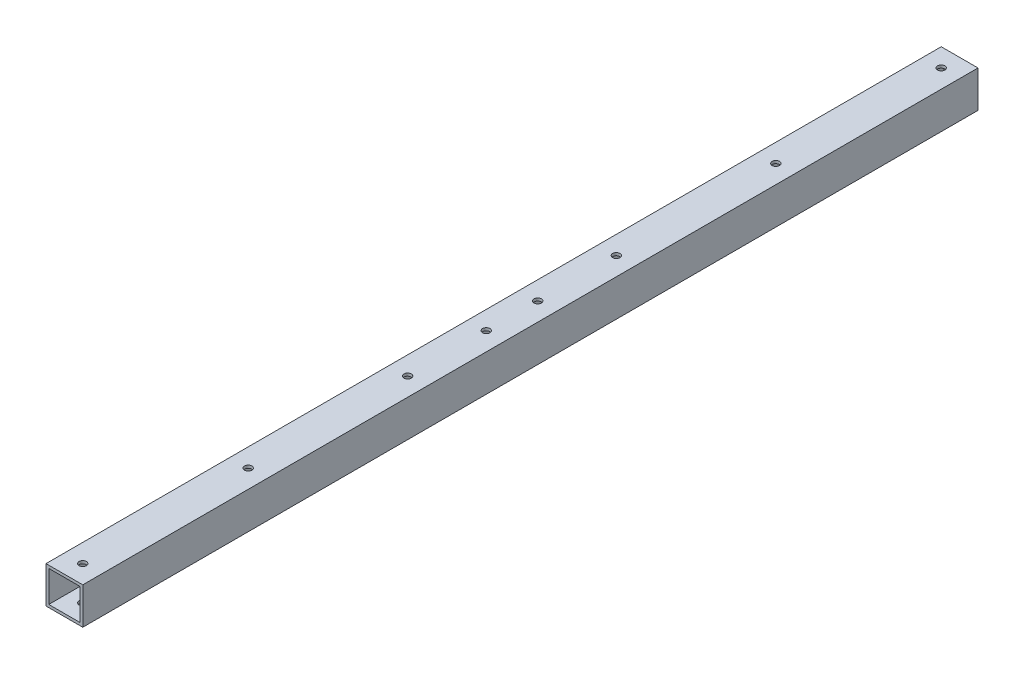
ISO-10303-21;
HEADER;
FILE_DESCRIPTION(('STEP AP214'),'2;1');
FILE_NAME('part.step','',(''),(''),'','','');
FILE_SCHEMA(('AUTOMOTIVE_DESIGN { 1 0 10303 214 1 1 1 1 }'));
ENDSEC;
DATA;
#1=APPLICATION_CONTEXT('core data for automotive mechanical design processes');
#2=APPLICATION_PROTOCOL_DEFINITION('international standard','automotive_design',2000,#1);
#3=PRODUCT_CONTEXT('',#1,'mechanical');
#4=PRODUCT('Part','Part','',(#3));
#5=PRODUCT_RELATED_PRODUCT_CATEGORY('part','',(#4));
#6=PRODUCT_DEFINITION_FORMATION('','',#4);
#7=PRODUCT_DEFINITION_CONTEXT('part definition',#1,'design');
#8=PRODUCT_DEFINITION('design','',#6,#7);
#9=PRODUCT_DEFINITION_SHAPE('','',#8);
#10=(LENGTH_UNIT() NAMED_UNIT(*) SI_UNIT(.MILLI.,.METRE.));
#11=(NAMED_UNIT(*) PLANE_ANGLE_UNIT() SI_UNIT($,.RADIAN.));
#12=(NAMED_UNIT(*) SI_UNIT($,.STERADIAN.) SOLID_ANGLE_UNIT());
#13=UNCERTAINTY_MEASURE_WITH_UNIT(LENGTH_MEASURE(1.E-05),#10,'distance_accuracy_value','');
#14=(GEOMETRIC_REPRESENTATION_CONTEXT(3) GLOBAL_UNCERTAINTY_ASSIGNED_CONTEXT((#13)) GLOBAL_UNIT_ASSIGNED_CONTEXT((#10,
#11,#12)) REPRESENTATION_CONTEXT('',''));
#15=CARTESIAN_POINT('',(0.,0.,0.));
#16=DIRECTION('',(0.,0.,1.));
#17=DIRECTION('',(1.,0.,0.));
#18=AXIS2_PLACEMENT_3D('',#15,#16,#17);
#19=CARTESIAN_POINT('',(0.,0.,487.));
#20=DIRECTION('',(0.,0.,1.));
#21=DIRECTION('',(1.,0.,0.));
#22=AXIS2_PLACEMENT_3D('',#19,#20,#21);
#23=PLANE('',#22);
#24=DIRECTION('',(0.,1.,0.));
#25=VECTOR('',#24,1.);
#26=CARTESIAN_POINT('',(10.,10.,487.));
#27=LINE('',#26,#25);
#28=CARTESIAN_POINT('',(10.,-10.,487.));
#29=VERTEX_POINT('',#28);
#30=CARTESIAN_POINT('',(10.,10.,487.));
#31=VERTEX_POINT('',#30);
#32=EDGE_CURVE('E156',#29,#31,#27,.T.);
#33=ORIENTED_EDGE('',*,*,#32,.T.);
#34=DIRECTION('',(-1.,0.,0.));
#35=VECTOR('',#34,1.);
#36=CARTESIAN_POINT('',(-10.,10.,487.));
#37=LINE('',#36,#35);
#38=CARTESIAN_POINT('',(-10.,10.,487.));
#39=VERTEX_POINT('',#38);
#40=EDGE_CURVE('E160',#31,#39,#37,.T.);
#41=ORIENTED_EDGE('',*,*,#40,.T.);
#42=DIRECTION('',(0.,-1.,0.));
#43=VECTOR('',#42,1.);
#44=CARTESIAN_POINT('',(-10.,10.,487.));
#45=LINE('',#44,#43);
#46=CARTESIAN_POINT('',(-10.,-10.,487.));
#47=VERTEX_POINT('',#46);
#48=EDGE_CURVE('E164',#39,#47,#45,.T.);
#49=ORIENTED_EDGE('',*,*,#48,.T.);
#50=DIRECTION('',(1.,0.,0.));
#51=VECTOR('',#50,1.);
#52=CARTESIAN_POINT('',(-10.,-10.,487.));
#53=LINE('',#52,#51);
#54=EDGE_CURVE('E167',#47,#29,#53,.T.);
#55=ORIENTED_EDGE('',*,*,#54,.T.);
#56=EDGE_LOOP('',(#33,#41,#49,#55));
#57=FACE_BOUND('',#56,.T.);
#58=DIRECTION('',(-1.,0.,0.));
#59=VECTOR('',#58,1.);
#60=CARTESIAN_POINT('',(-8.5,8.5,487.));
#61=LINE('',#60,#59);
#62=CARTESIAN_POINT('',(8.5,8.5,487.));
#63=VERTEX_POINT('',#62);
#64=CARTESIAN_POINT('',(-8.5,8.5,487.));
#65=VERTEX_POINT('',#64);
#66=EDGE_CURVE('E115',#63,#65,#61,.T.);
#67=ORIENTED_EDGE('',*,*,#66,.F.);
#68=DIRECTION('',(0.,1.,0.));
#69=VECTOR('',#68,1.);
#70=CARTESIAN_POINT('',(8.5,8.5,487.));
#71=LINE('',#70,#69);
#72=CARTESIAN_POINT('',(8.50000000000001,-8.5,487.));
#73=VERTEX_POINT('',#72);
#74=EDGE_CURVE('E106',#73,#63,#71,.T.);
#75=ORIENTED_EDGE('',*,*,#74,.F.);
#76=DIRECTION('',(1.,0.,0.));
#77=VECTOR('',#76,1.);
#78=CARTESIAN_POINT('',(-8.5,-8.5,487.));
#79=LINE('',#78,#77);
#80=CARTESIAN_POINT('',(-8.5,-8.5,487.));
#81=VERTEX_POINT('',#80);
#82=EDGE_CURVE('E132',#81,#73,#79,.T.);
#83=ORIENTED_EDGE('',*,*,#82,.F.);
#84=DIRECTION('',(0.,-1.,0.));
#85=VECTOR('',#84,1.);
#86=CARTESIAN_POINT('',(-8.5,8.5,487.));
#87=LINE('',#86,#85);
#88=EDGE_CURVE('E128',#65,#81,#87,.T.);
#89=ORIENTED_EDGE('',*,*,#88,.F.);
#90=EDGE_LOOP('',(#67,#75,#83,#89));
#91=FACE_BOUND('',#90,.T.);
#92=ADVANCED_FACE('F38',(#57,#91),#23,.T.);
#93=CARTESIAN_POINT('',(0.,0.,0.));
#94=DIRECTION('',(0.,0.,1.));
#95=DIRECTION('',(1.,0.,0.));
#96=AXIS2_PLACEMENT_3D('',#93,#94,#95);
#97=PLANE('',#96);
#98=DIRECTION('',(0.,1.,0.));
#99=VECTOR('',#98,1.);
#100=CARTESIAN_POINT('',(10.,10.,0.));
#101=LINE('',#100,#99);
#102=CARTESIAN_POINT('',(10.,-10.,0.));
#103=VERTEX_POINT('',#102);
#104=CARTESIAN_POINT('',(10.,10.,0.));
#105=VERTEX_POINT('',#104);
#106=EDGE_CURVE('E124',#103,#105,#101,.T.);
#107=ORIENTED_EDGE('',*,*,#106,.F.);
#108=DIRECTION('',(1.,0.,0.));
#109=VECTOR('',#108,1.);
#110=CARTESIAN_POINT('',(-10.,-10.,0.));
#111=LINE('',#110,#109);
#112=CARTESIAN_POINT('',(-10.,-10.,0.));
#113=VERTEX_POINT('',#112);
#114=EDGE_CURVE('E161',#113,#103,#111,.T.);
#115=ORIENTED_EDGE('',*,*,#114,.F.);
#116=DIRECTION('',(0.,-1.,0.));
#117=VECTOR('',#116,1.);
#118=CARTESIAN_POINT('',(-10.,10.,0.));
#119=LINE('',#118,#117);
#120=CARTESIAN_POINT('',(-10.,10.,0.));
#121=VERTEX_POINT('',#120);
#122=EDGE_CURVE('E177',#121,#113,#119,.T.);
#123=ORIENTED_EDGE('',*,*,#122,.F.);
#124=DIRECTION('',(-1.,0.,0.));
#125=VECTOR('',#124,1.);
#126=CARTESIAN_POINT('',(-10.,10.,0.));
#127=LINE('',#126,#125);
#128=EDGE_CURVE('E174',#105,#121,#127,.T.);
#129=ORIENTED_EDGE('',*,*,#128,.F.);
#130=EDGE_LOOP('',(#107,#115,#123,#129));
#131=FACE_BOUND('',#130,.T.);
#132=DIRECTION('',(0.,1.,0.));
#133=VECTOR('',#132,1.);
#134=CARTESIAN_POINT('',(8.5,8.5,0.));
#135=LINE('',#134,#133);
#136=CARTESIAN_POINT('',(8.50000000000001,-8.5,0.));
#137=VERTEX_POINT('',#136);
#138=CARTESIAN_POINT('',(8.5,8.5,0.));
#139=VERTEX_POINT('',#138);
#140=EDGE_CURVE('E64',#137,#139,#135,.T.);
#141=ORIENTED_EDGE('',*,*,#140,.T.);
#142=DIRECTION('',(-1.,0.,0.));
#143=VECTOR('',#142,1.);
#144=CARTESIAN_POINT('',(-8.5,8.5,0.));
#145=LINE('',#144,#143);
#146=CARTESIAN_POINT('',(-8.5,8.5,0.));
#147=VERTEX_POINT('',#146);
#148=EDGE_CURVE('E122',#139,#147,#145,.T.);
#149=ORIENTED_EDGE('',*,*,#148,.T.);
#150=DIRECTION('',(0.,-1.,0.));
#151=VECTOR('',#150,1.);
#152=CARTESIAN_POINT('',(-8.5,8.5,0.));
#153=LINE('',#152,#151);
#154=CARTESIAN_POINT('',(-8.5,-8.5,0.));
#155=VERTEX_POINT('',#154);
#156=EDGE_CURVE('E143',#147,#155,#153,.T.);
#157=ORIENTED_EDGE('',*,*,#156,.T.);
#158=DIRECTION('',(1.,0.,0.));
#159=VECTOR('',#158,1.);
#160=CARTESIAN_POINT('',(-8.5,-8.5,0.));
#161=LINE('',#160,#159);
#162=EDGE_CURVE('E116',#155,#137,#161,.T.);
#163=ORIENTED_EDGE('',*,*,#162,.T.);
#164=EDGE_LOOP('',(#141,#149,#157,#163));
#165=FACE_BOUND('',#164,.T.);
#166=ADVANCED_FACE('F359',(#131,#165),#97,.F.);
#167=CARTESIAN_POINT('',(10.,10.,487.));
#168=DIRECTION('',(-1.,0.,0.));
#169=DIRECTION('',(0.,0.,1.));
#170=AXIS2_PLACEMENT_3D('',#167,#168,#169);
#171=PLANE('',#170);
#172=ORIENTED_EDGE('',*,*,#106,.T.);
#173=DIRECTION('',(0.,0.,-1.));
#174=VECTOR('',#173,1.);
#175=CARTESIAN_POINT('',(10.,10.,487.));
#176=LINE('',#175,#174);
#177=EDGE_CURVE('E11',#31,#105,#176,.T.);
#178=ORIENTED_EDGE('',*,*,#177,.F.);
#179=ORIENTED_EDGE('',*,*,#32,.F.);
#180=DIRECTION('',(0.,0.,-1.));
#181=VECTOR('',#180,1.);
#182=CARTESIAN_POINT('',(10.,-10.,487.));
#183=LINE('',#182,#181);
#184=EDGE_CURVE('E170',#29,#103,#183,.T.);
#185=ORIENTED_EDGE('',*,*,#184,.T.);
#186=EDGE_LOOP('',(#172,#178,#179,#185));
#187=FACE_BOUND('',#186,.T.);
#188=ADVANCED_FACE('F40',(#187),#171,.F.);
#189=CARTESIAN_POINT('',(-10.,10.,487.));
#190=DIRECTION('',(0.,-1.,0.));
#191=DIRECTION('',(0.,0.,-1.));
#192=AXIS2_PLACEMENT_3D('',#189,#190,#191);
#193=PLANE('',#192);
#194=CARTESIAN_POINT('',(0.,10.,229.5));
#195=DIRECTION('',(0.,1.,0.));
#196=DIRECTION('',(0.,0.,1.));
#197=AXIS2_PLACEMENT_3D('',#194,#195,#196);
#198=CIRCLE('',#197,2.);
#199=CARTESIAN_POINT('',(0.,10.,231.5));
#200=VERTEX_POINT('',#199);
#201=EDGE_CURVE('E233',#200,#200,#198,.T.);
#202=ORIENTED_EDGE('',*,*,#201,.F.);
#203=EDGE_LOOP('',(#202));
#204=FACE_BOUND('',#203,.T.);
#205=CARTESIAN_POINT('',(0.,10.,257.5));
#206=DIRECTION('',(0.,1.,0.));
#207=DIRECTION('',(0.,0.,1.));
#208=AXIS2_PLACEMENT_3D('',#205,#206,#207);
#209=CIRCLE('',#208,2.);
#210=CARTESIAN_POINT('',(0.,10.,259.5));
#211=VERTEX_POINT('',#210);
#212=EDGE_CURVE('E245',#211,#211,#209,.T.);
#213=ORIENTED_EDGE('',*,*,#212,.F.);
#214=EDGE_LOOP('',(#213));
#215=FACE_BOUND('',#214,.T.);
#216=CARTESIAN_POINT('',(0.,10.,10.));
#217=DIRECTION('',(0.,1.,0.));
#218=DIRECTION('',(0.,0.,1.));
#219=AXIS2_PLACEMENT_3D('',#216,#217,#218);
#220=CIRCLE('',#219,2.);
#221=CARTESIAN_POINT('',(0.,10.,12.));
#222=VERTEX_POINT('',#221);
#223=EDGE_CURVE('E257',#222,#222,#220,.T.);
#224=ORIENTED_EDGE('',*,*,#223,.F.);
#225=EDGE_LOOP('',(#224));
#226=FACE_BOUND('',#225,.T.);
#227=CARTESIAN_POINT('',(0.,10.,300.25));
#228=DIRECTION('',(0.,1.,0.));
#229=DIRECTION('',(0.,0.,1.));
#230=AXIS2_PLACEMENT_3D('',#227,#228,#229);
#231=CIRCLE('',#230,2.00000000000001);
#232=CARTESIAN_POINT('',(0.,10.,302.25));
#233=VERTEX_POINT('',#232);
#234=EDGE_CURVE('E253',#233,#233,#231,.T.);
#235=ORIENTED_EDGE('',*,*,#234,.F.);
#236=EDGE_LOOP('',(#235));
#237=FACE_BOUND('',#236,.T.);
#238=CARTESIAN_POINT('',(0.,10.,477.));
#239=DIRECTION('',(0.,1.,0.));
#240=DIRECTION('',(0.,0.,1.));
#241=AXIS2_PLACEMENT_3D('',#238,#239,#240);
#242=CIRCLE('',#241,2.);
#243=CARTESIAN_POINT('',(0.,10.,479.));
#244=VERTEX_POINT('',#243);
#245=EDGE_CURVE('E289',#244,#244,#242,.T.);
#246=ORIENTED_EDGE('',*,*,#245,.F.);
#247=EDGE_LOOP('',(#246));
#248=FACE_BOUND('',#247,.T.);
#249=CARTESIAN_POINT('',(0.,10.,100.));
#250=DIRECTION('',(0.,1.,0.));
#251=DIRECTION('',(0.,0.,1.));
#252=AXIS2_PLACEMENT_3D('',#249,#250,#251);
#253=CIRCLE('',#252,2.);
#254=CARTESIAN_POINT('',(0.,10.,102.));
#255=VERTEX_POINT('',#254);
#256=EDGE_CURVE('E274',#255,#255,#253,.T.);
#257=ORIENTED_EDGE('',*,*,#256,.F.);
#258=EDGE_LOOP('',(#257));
#259=FACE_BOUND('',#258,.T.);
#260=CARTESIAN_POINT('',(0.,10.,387.));
#261=DIRECTION('',(0.,1.,0.));
#262=DIRECTION('',(0.,0.,1.));
#263=AXIS2_PLACEMENT_3D('',#260,#261,#262);
#264=CIRCLE('',#263,2.);
#265=CARTESIAN_POINT('',(0.,10.,389.));
#266=VERTEX_POINT('',#265);
#267=EDGE_CURVE('E275',#266,#266,#264,.T.);
#268=ORIENTED_EDGE('',*,*,#267,.F.);
#269=EDGE_LOOP('',(#268));
#270=FACE_BOUND('',#269,.T.);
#271=CARTESIAN_POINT('',(0.,10.,186.75));
#272=DIRECTION('',(0.,1.,0.));
#273=DIRECTION('',(0.,0.,1.));
#274=AXIS2_PLACEMENT_3D('',#271,#272,#273);
#275=CIRCLE('',#274,2.00000000000001);
#276=CARTESIAN_POINT('',(0.,10.,188.75));
#277=VERTEX_POINT('',#276);
#278=EDGE_CURVE('E266',#277,#277,#275,.T.);
#279=ORIENTED_EDGE('',*,*,#278,.F.);
#280=EDGE_LOOP('',(#279));
#281=FACE_BOUND('',#280,.T.);
#282=ORIENTED_EDGE('',*,*,#128,.T.);
#283=DIRECTION('',(0.,0.,-1.));
#284=VECTOR('',#283,1.);
#285=CARTESIAN_POINT('',(-10.,10.,487.));
#286=LINE('',#285,#284);
#287=EDGE_CURVE('E48',#39,#121,#286,.T.);
#288=ORIENTED_EDGE('',*,*,#287,.F.);
#289=ORIENTED_EDGE('',*,*,#40,.F.);
#290=ORIENTED_EDGE('',*,*,#177,.T.);
#291=EDGE_LOOP('',(#282,#288,#289,#290));
#292=FACE_BOUND('',#291,.T.);
#293=ADVANCED_FACE('F345',(#204,#215,#226,#237,#248,#259,#270,#281,#292),#193,.F.);
#294=CARTESIAN_POINT('',(-10.,10.,487.));
#295=DIRECTION('',(1.,0.,0.));
#296=DIRECTION('',(0.,1.,0.));
#297=AXIS2_PLACEMENT_3D('',#294,#295,#296);
#298=PLANE('',#297);
#299=ORIENTED_EDGE('',*,*,#122,.T.);
#300=DIRECTION('',(0.,0.,-1.));
#301=VECTOR('',#300,1.);
#302=CARTESIAN_POINT('',(-10.,-10.,487.));
#303=LINE('',#302,#301);
#304=EDGE_CURVE('E185',#47,#113,#303,.T.);
#305=ORIENTED_EDGE('',*,*,#304,.F.);
#306=ORIENTED_EDGE('',*,*,#48,.F.);
#307=ORIENTED_EDGE('',*,*,#287,.T.);
#308=EDGE_LOOP('',(#299,#305,#306,#307));
#309=FACE_BOUND('',#308,.T.);
#310=ADVANCED_FACE('F348',(#309),#298,.F.);
#311=CARTESIAN_POINT('',(-10.,-10.,487.));
#312=DIRECTION('',(0.,1.,0.));
#313=DIRECTION('',(0.,0.,1.));
#314=AXIS2_PLACEMENT_3D('',#311,#312,#313);
#315=PLANE('',#314);
#316=CARTESIAN_POINT('',(0.,-10.,229.5));
#317=DIRECTION('',(0.,1.,0.));
#318=DIRECTION('',(0.,0.,1.));
#319=AXIS2_PLACEMENT_3D('',#316,#317,#318);
#320=CIRCLE('',#319,2.);
#321=CARTESIAN_POINT('',(0.,-10.,231.5));
#322=VERTEX_POINT('',#321);
#323=EDGE_CURVE('E225',#322,#322,#320,.T.);
#324=ORIENTED_EDGE('',*,*,#323,.T.);
#325=EDGE_LOOP('',(#324));
#326=FACE_BOUND('',#325,.T.);
#327=CARTESIAN_POINT('',(0.,-10.,257.5));
#328=DIRECTION('',(0.,1.,0.));
#329=DIRECTION('',(0.,0.,1.));
#330=AXIS2_PLACEMENT_3D('',#327,#328,#329);
#331=CIRCLE('',#330,2.);
#332=CARTESIAN_POINT('',(0.,-10.,259.5));
#333=VERTEX_POINT('',#332);
#334=EDGE_CURVE('E239',#333,#333,#331,.T.);
#335=ORIENTED_EDGE('',*,*,#334,.T.);
#336=EDGE_LOOP('',(#335));
#337=FACE_BOUND('',#336,.T.);
#338=CARTESIAN_POINT('',(0.,-10.,10.));
#339=DIRECTION('',(0.,1.,0.));
#340=DIRECTION('',(0.,0.,1.));
#341=AXIS2_PLACEMENT_3D('',#338,#339,#340);
#342=CIRCLE('',#341,2.);
#343=CARTESIAN_POINT('',(0.,-10.,12.));
#344=VERTEX_POINT('',#343);
#345=EDGE_CURVE('E197',#344,#344,#342,.T.);
#346=ORIENTED_EDGE('',*,*,#345,.T.);
#347=EDGE_LOOP('',(#346));
#348=FACE_BOUND('',#347,.T.);
#349=CARTESIAN_POINT('',(0.,-10.,300.25));
#350=DIRECTION('',(0.,1.,0.));
#351=DIRECTION('',(0.,0.,1.));
#352=AXIS2_PLACEMENT_3D('',#349,#350,#351);
#353=CIRCLE('',#352,2.00000000000001);
#354=CARTESIAN_POINT('',(0.,-10.,302.25));
#355=VERTEX_POINT('',#354);
#356=EDGE_CURVE('E262',#355,#355,#353,.T.);
#357=ORIENTED_EDGE('',*,*,#356,.T.);
#358=EDGE_LOOP('',(#357));
#359=FACE_BOUND('',#358,.T.);
#360=CARTESIAN_POINT('',(0.,-10.,477.));
#361=DIRECTION('',(0.,1.,0.));
#362=DIRECTION('',(0.,0.,1.));
#363=AXIS2_PLACEMENT_3D('',#360,#361,#362);
#364=CIRCLE('',#363,2.);
#365=CARTESIAN_POINT('',(0.,-10.,479.));
#366=VERTEX_POINT('',#365);
#367=EDGE_CURVE('E261',#366,#366,#364,.T.);
#368=ORIENTED_EDGE('',*,*,#367,.T.);
#369=EDGE_LOOP('',(#368));
#370=FACE_BOUND('',#369,.T.);
#371=CARTESIAN_POINT('',(0.,-10.,100.));
#372=DIRECTION('',(0.,1.,0.));
#373=DIRECTION('',(0.,0.,1.));
#374=AXIS2_PLACEMENT_3D('',#371,#372,#373);
#375=CIRCLE('',#374,2.);
#376=CARTESIAN_POINT('',(0.,-10.,102.));
#377=VERTEX_POINT('',#376);
#378=EDGE_CURVE('E293',#377,#377,#375,.T.);
#379=ORIENTED_EDGE('',*,*,#378,.T.);
#380=EDGE_LOOP('',(#379));
#381=FACE_BOUND('',#380,.T.);
#382=CARTESIAN_POINT('',(0.,-10.,387.));
#383=DIRECTION('',(0.,1.,0.));
#384=DIRECTION('',(0.,0.,1.));
#385=AXIS2_PLACEMENT_3D('',#382,#383,#384);
#386=CIRCLE('',#385,2.);
#387=CARTESIAN_POINT('',(0.,-10.,389.));
#388=VERTEX_POINT('',#387);
#389=EDGE_CURVE('E270',#388,#388,#386,.T.);
#390=ORIENTED_EDGE('',*,*,#389,.T.);
#391=EDGE_LOOP('',(#390));
#392=FACE_BOUND('',#391,.T.);
#393=CARTESIAN_POINT('',(0.,-10.,186.75));
#394=DIRECTION('',(0.,1.,0.));
#395=DIRECTION('',(0.,0.,1.));
#396=AXIS2_PLACEMENT_3D('',#393,#394,#395);
#397=CIRCLE('',#396,2.00000000000001);
#398=CARTESIAN_POINT('',(0.,-10.,188.75));
#399=VERTEX_POINT('',#398);
#400=EDGE_CURVE('E279',#399,#399,#397,.T.);
#401=ORIENTED_EDGE('',*,*,#400,.T.);
#402=EDGE_LOOP('',(#401));
#403=FACE_BOUND('',#402,.T.);
#404=ORIENTED_EDGE('',*,*,#114,.T.);
#405=ORIENTED_EDGE('',*,*,#184,.F.);
#406=ORIENTED_EDGE('',*,*,#54,.F.);
#407=ORIENTED_EDGE('',*,*,#304,.T.);
#408=EDGE_LOOP('',(#404,#405,#406,#407));
#409=FACE_BOUND('',#408,.T.);
#410=ADVANCED_FACE('F363',(#326,#337,#348,#359,#370,#381,#392,#403,#409),#315,.F.);
#411=CARTESIAN_POINT('',(8.5,8.5,487.));
#412=DIRECTION('',(-1.,0.,0.));
#413=DIRECTION('',(0.,-1.,0.));
#414=AXIS2_PLACEMENT_3D('',#411,#412,#413);
#415=PLANE('',#414);
#416=ORIENTED_EDGE('',*,*,#140,.F.);
#417=DIRECTION('',(0.,0.,-1.));
#418=VECTOR('',#417,1.);
#419=CARTESIAN_POINT('',(8.50000000000001,-8.5,487.));
#420=LINE('',#419,#418);
#421=EDGE_CURVE('E110',#73,#137,#420,.T.);
#422=ORIENTED_EDGE('',*,*,#421,.F.);
#423=ORIENTED_EDGE('',*,*,#74,.T.);
#424=DIRECTION('',(0.,0.,-1.));
#425=VECTOR('',#424,1.);
#426=CARTESIAN_POINT('',(8.5,8.5,487.));
#427=LINE('',#426,#425);
#428=EDGE_CURVE('E109',#63,#139,#427,.T.);
#429=ORIENTED_EDGE('',*,*,#428,.T.);
#430=EDGE_LOOP('',(#416,#422,#423,#429));
#431=FACE_BOUND('',#430,.T.);
#432=ADVANCED_FACE('F108',(#431),#415,.T.);
#433=CARTESIAN_POINT('',(-8.5,8.5,487.));
#434=DIRECTION('',(0.,-1.,0.));
#435=DIRECTION('',(0.,0.,-1.));
#436=AXIS2_PLACEMENT_3D('',#433,#434,#435);
#437=PLANE('',#436);
#438=CARTESIAN_POINT('',(0.,8.5,229.5));
#439=DIRECTION('',(0.,-1.,0.));
#440=DIRECTION('',(0.,0.,-1.));
#441=AXIS2_PLACEMENT_3D('',#438,#439,#440);
#442=CIRCLE('',#441,2.);
#443=CARTESIAN_POINT('',(0.,8.5,227.5));
#444=VERTEX_POINT('',#443);
#445=EDGE_CURVE('E249',#444,#444,#442,.T.);
#446=ORIENTED_EDGE('',*,*,#445,.F.);
#447=EDGE_LOOP('',(#446));
#448=FACE_BOUND('',#447,.T.);
#449=CARTESIAN_POINT('',(0.,8.5,257.5));
#450=DIRECTION('',(0.,-1.,0.));
#451=DIRECTION('',(0.,0.,-1.));
#452=AXIS2_PLACEMENT_3D('',#449,#450,#451);
#453=CIRCLE('',#452,2.);
#454=CARTESIAN_POINT('',(0.,8.5,255.5));
#455=VERTEX_POINT('',#454);
#456=EDGE_CURVE('E224',#455,#455,#453,.T.);
#457=ORIENTED_EDGE('',*,*,#456,.F.);
#458=EDGE_LOOP('',(#457));
#459=FACE_BOUND('',#458,.T.);
#460=CARTESIAN_POINT('',(0.,8.5,10.));
#461=DIRECTION('',(0.,-1.,0.));
#462=DIRECTION('',(0.,0.,-1.));
#463=AXIS2_PLACEMENT_3D('',#460,#461,#462);
#464=CIRCLE('',#463,2.);
#465=CARTESIAN_POINT('',(0.,8.5,8.));
#466=VERTEX_POINT('',#465);
#467=EDGE_CURVE('E140',#466,#466,#464,.T.);
#468=ORIENTED_EDGE('',*,*,#467,.F.);
#469=EDGE_LOOP('',(#468));
#470=FACE_BOUND('',#469,.T.);
#471=CARTESIAN_POINT('',(0.,8.5,300.25));
#472=DIRECTION('',(0.,-1.,0.));
#473=DIRECTION('',(0.,0.,-1.));
#474=AXIS2_PLACEMENT_3D('',#471,#472,#473);
#475=CIRCLE('',#474,2.00000000000001);
#476=CARTESIAN_POINT('',(0.,8.5,298.25));
#477=VERTEX_POINT('',#476);
#478=EDGE_CURVE('E217',#477,#477,#475,.T.);
#479=ORIENTED_EDGE('',*,*,#478,.F.);
#480=EDGE_LOOP('',(#479));
#481=FACE_BOUND('',#480,.T.);
#482=CARTESIAN_POINT('',(0.,8.5,477.));
#483=DIRECTION('',(0.,-1.,0.));
#484=DIRECTION('',(0.,0.,-1.));
#485=AXIS2_PLACEMENT_3D('',#482,#483,#484);
#486=CIRCLE('',#485,2.);
#487=CARTESIAN_POINT('',(0.,8.5,475.));
#488=VERTEX_POINT('',#487);
#489=EDGE_CURVE('E212',#488,#488,#486,.T.);
#490=ORIENTED_EDGE('',*,*,#489,.F.);
#491=EDGE_LOOP('',(#490));
#492=FACE_BOUND('',#491,.T.);
#493=CARTESIAN_POINT('',(0.,8.5,100.));
#494=DIRECTION('',(0.,-1.,0.));
#495=DIRECTION('',(0.,0.,-1.));
#496=AXIS2_PLACEMENT_3D('',#493,#494,#495);
#497=CIRCLE('',#496,2.);
#498=CARTESIAN_POINT('',(0.,8.5,98.));
#499=VERTEX_POINT('',#498);
#500=EDGE_CURVE('E207',#499,#499,#497,.T.);
#501=ORIENTED_EDGE('',*,*,#500,.F.);
#502=EDGE_LOOP('',(#501));
#503=FACE_BOUND('',#502,.T.);
#504=CARTESIAN_POINT('',(0.,8.5,387.));
#505=DIRECTION('',(0.,-1.,0.));
#506=DIRECTION('',(0.,0.,-1.));
#507=AXIS2_PLACEMENT_3D('',#504,#505,#506);
#508=CIRCLE('',#507,2.);
#509=CARTESIAN_POINT('',(0.,8.5,385.));
#510=VERTEX_POINT('',#509);
#511=EDGE_CURVE('E202',#510,#510,#508,.T.);
#512=ORIENTED_EDGE('',*,*,#511,.F.);
#513=EDGE_LOOP('',(#512));
#514=FACE_BOUND('',#513,.T.);
#515=CARTESIAN_POINT('',(0.,8.5,186.75));
#516=DIRECTION('',(0.,-1.,0.));
#517=DIRECTION('',(0.,0.,-1.));
#518=AXIS2_PLACEMENT_3D('',#515,#516,#517);
#519=CIRCLE('',#518,2.00000000000001);
#520=CARTESIAN_POINT('',(0.,8.5,184.75));
#521=VERTEX_POINT('',#520);
#522=EDGE_CURVE('E196',#521,#521,#519,.T.);
#523=ORIENTED_EDGE('',*,*,#522,.F.);
#524=EDGE_LOOP('',(#523));
#525=FACE_BOUND('',#524,.T.);
#526=ORIENTED_EDGE('',*,*,#148,.F.);
#527=ORIENTED_EDGE('',*,*,#428,.F.);
#528=ORIENTED_EDGE('',*,*,#66,.T.);
#529=DIRECTION('',(0.,0.,-1.));
#530=VECTOR('',#529,1.);
#531=CARTESIAN_POINT('',(-8.5,8.5,487.));
#532=LINE('',#531,#530);
#533=EDGE_CURVE('E125',#65,#147,#532,.T.);
#534=ORIENTED_EDGE('',*,*,#533,.T.);
#535=EDGE_LOOP('',(#526,#527,#528,#534));
#536=FACE_BOUND('',#535,.T.);
#537=ADVANCED_FACE('F119',(#448,#459,#470,#481,#492,#503,#514,#525,#536),#437,.T.);
#538=CARTESIAN_POINT('',(-8.5,8.5,487.));
#539=DIRECTION('',(1.,0.,0.));
#540=DIRECTION('',(0.,1.,0.));
#541=AXIS2_PLACEMENT_3D('',#538,#539,#540);
#542=PLANE('',#541);
#543=ORIENTED_EDGE('',*,*,#156,.F.);
#544=ORIENTED_EDGE('',*,*,#533,.F.);
#545=ORIENTED_EDGE('',*,*,#88,.T.);
#546=DIRECTION('',(0.,0.,-1.));
#547=VECTOR('',#546,1.);
#548=CARTESIAN_POINT('',(-8.5,-8.5,487.));
#549=LINE('',#548,#547);
#550=EDGE_CURVE('E56',#81,#155,#549,.T.);
#551=ORIENTED_EDGE('',*,*,#550,.T.);
#552=EDGE_LOOP('',(#543,#544,#545,#551));
#553=FACE_BOUND('',#552,.T.);
#554=ADVANCED_FACE('F323',(#553),#542,.T.);
#555=CARTESIAN_POINT('',(-8.5,-8.5,487.));
#556=DIRECTION('',(0.,1.,0.));
#557=DIRECTION('',(0.,0.,1.));
#558=AXIS2_PLACEMENT_3D('',#555,#556,#557);
#559=PLANE('',#558);
#560=CARTESIAN_POINT('',(0.,-8.5,229.5));
#561=DIRECTION('',(0.,1.,0.));
#562=DIRECTION('',(0.,0.,1.));
#563=AXIS2_PLACEMENT_3D('',#560,#561,#562);
#564=CIRCLE('',#563,2.);
#565=CARTESIAN_POINT('',(0.,-8.5,231.5));
#566=VERTEX_POINT('',#565);
#567=EDGE_CURVE('E42',#566,#566,#564,.T.);
#568=ORIENTED_EDGE('',*,*,#567,.F.);
#569=EDGE_LOOP('',(#568));
#570=FACE_BOUND('',#569,.T.);
#571=CARTESIAN_POINT('',(0.,-8.5,257.5));
#572=DIRECTION('',(0.,1.,0.));
#573=DIRECTION('',(0.,0.,1.));
#574=AXIS2_PLACEMENT_3D('',#571,#572,#573);
#575=CIRCLE('',#574,2.);
#576=CARTESIAN_POINT('',(0.,-8.5,259.5));
#577=VERTEX_POINT('',#576);
#578=EDGE_CURVE('E221',#577,#577,#575,.T.);
#579=ORIENTED_EDGE('',*,*,#578,.F.);
#580=EDGE_LOOP('',(#579));
#581=FACE_BOUND('',#580,.T.);
#582=CARTESIAN_POINT('',(0.,-8.5,10.));
#583=DIRECTION('',(0.,1.,0.));
#584=DIRECTION('',(0.,0.,1.));
#585=AXIS2_PLACEMENT_3D('',#582,#583,#584);
#586=CIRCLE('',#585,2.);
#587=CARTESIAN_POINT('',(0.,-8.5,12.));
#588=VERTEX_POINT('',#587);
#589=EDGE_CURVE('E218',#588,#588,#586,.T.);
#590=ORIENTED_EDGE('',*,*,#589,.F.);
#591=EDGE_LOOP('',(#590));
#592=FACE_BOUND('',#591,.T.);
#593=CARTESIAN_POINT('',(0.,-8.5,300.25));
#594=DIRECTION('',(0.,1.,0.));
#595=DIRECTION('',(0.,0.,1.));
#596=AXIS2_PLACEMENT_3D('',#593,#594,#595);
#597=CIRCLE('',#596,2.00000000000001);
#598=CARTESIAN_POINT('',(0.,-8.5,302.25));
#599=VERTEX_POINT('',#598);
#600=EDGE_CURVE('E213',#599,#599,#597,.T.);
#601=ORIENTED_EDGE('',*,*,#600,.F.);
#602=EDGE_LOOP('',(#601));
#603=FACE_BOUND('',#602,.T.);
#604=CARTESIAN_POINT('',(0.,-8.5,477.));
#605=DIRECTION('',(0.,1.,0.));
#606=DIRECTION('',(0.,0.,1.));
#607=AXIS2_PLACEMENT_3D('',#604,#605,#606);
#608=CIRCLE('',#607,2.);
#609=CARTESIAN_POINT('',(0.,-8.5,479.));
#610=VERTEX_POINT('',#609);
#611=EDGE_CURVE('E208',#610,#610,#608,.T.);
#612=ORIENTED_EDGE('',*,*,#611,.F.);
#613=EDGE_LOOP('',(#612));
#614=FACE_BOUND('',#613,.T.);
#615=CARTESIAN_POINT('',(0.,-8.5,100.));
#616=DIRECTION('',(0.,1.,0.));
#617=DIRECTION('',(0.,0.,1.));
#618=AXIS2_PLACEMENT_3D('',#615,#616,#617);
#619=CIRCLE('',#618,2.);
#620=CARTESIAN_POINT('',(0.,-8.5,102.));
#621=VERTEX_POINT('',#620);
#622=EDGE_CURVE('E203',#621,#621,#619,.T.);
#623=ORIENTED_EDGE('',*,*,#622,.F.);
#624=EDGE_LOOP('',(#623));
#625=FACE_BOUND('',#624,.T.);
#626=CARTESIAN_POINT('',(0.,-8.5,387.));
#627=DIRECTION('',(0.,1.,0.));
#628=DIRECTION('',(0.,0.,1.));
#629=AXIS2_PLACEMENT_3D('',#626,#627,#628);
#630=CIRCLE('',#629,2.);
#631=CARTESIAN_POINT('',(0.,-8.5,389.));
#632=VERTEX_POINT('',#631);
#633=EDGE_CURVE('E198',#632,#632,#630,.T.);
#634=ORIENTED_EDGE('',*,*,#633,.F.);
#635=EDGE_LOOP('',(#634));
#636=FACE_BOUND('',#635,.T.);
#637=CARTESIAN_POINT('',(0.,-8.5,186.75));
#638=DIRECTION('',(0.,1.,0.));
#639=DIRECTION('',(0.,0.,1.));
#640=AXIS2_PLACEMENT_3D('',#637,#638,#639);
#641=CIRCLE('',#640,2.00000000000001);
#642=CARTESIAN_POINT('',(0.,-8.5,188.75));
#643=VERTEX_POINT('',#642);
#644=EDGE_CURVE('E192',#643,#643,#641,.T.);
#645=ORIENTED_EDGE('',*,*,#644,.F.);
#646=EDGE_LOOP('',(#645));
#647=FACE_BOUND('',#646,.T.);
#648=ORIENTED_EDGE('',*,*,#162,.F.);
#649=ORIENTED_EDGE('',*,*,#550,.F.);
#650=ORIENTED_EDGE('',*,*,#82,.T.);
#651=ORIENTED_EDGE('',*,*,#421,.T.);
#652=EDGE_LOOP('',(#648,#649,#650,#651));
#653=FACE_BOUND('',#652,.T.);
#654=ADVANCED_FACE('F411',(#570,#581,#592,#603,#614,#625,#636,#647,#653),#559,.T.);
#655=CARTESIAN_POINT('',(0.,-10.,186.75));
#656=DIRECTION('',(0.,1.,0.));
#657=DIRECTION('',(0.,0.,1.));
#658=AXIS2_PLACEMENT_3D('',#655,#656,#657);
#659=CYLINDRICAL_SURFACE('',#658,2.00000000000001);
#660=ORIENTED_EDGE('',*,*,#644,.T.);
#661=EDGE_LOOP('',(#660));
#662=FACE_BOUND('',#661,.T.);
#663=ORIENTED_EDGE('',*,*,#400,.F.);
#664=EDGE_LOOP('',(#663));
#665=FACE_BOUND('',#664,.T.);
#666=ADVANCED_FACE('F342',(#662,#665),#659,.F.);
#667=CARTESIAN_POINT('',(0.,-10.,387.));
#668=DIRECTION('',(0.,1.,0.));
#669=DIRECTION('',(0.,0.,1.));
#670=AXIS2_PLACEMENT_3D('',#667,#668,#669);
#671=CYLINDRICAL_SURFACE('',#670,2.);
#672=ORIENTED_EDGE('',*,*,#633,.T.);
#673=EDGE_LOOP('',(#672));
#674=FACE_BOUND('',#673,.T.);
#675=ORIENTED_EDGE('',*,*,#389,.F.);
#676=EDGE_LOOP('',(#675));
#677=FACE_BOUND('',#676,.T.);
#678=ADVANCED_FACE('F428',(#674,#677),#671,.F.);
#679=CARTESIAN_POINT('',(0.,-10.,100.));
#680=DIRECTION('',(0.,1.,0.));
#681=DIRECTION('',(0.,0.,1.));
#682=AXIS2_PLACEMENT_3D('',#679,#680,#681);
#683=CYLINDRICAL_SURFACE('',#682,2.);
#684=ORIENTED_EDGE('',*,*,#622,.T.);
#685=EDGE_LOOP('',(#684));
#686=FACE_BOUND('',#685,.T.);
#687=ORIENTED_EDGE('',*,*,#378,.F.);
#688=EDGE_LOOP('',(#687));
#689=FACE_BOUND('',#688,.T.);
#690=ADVANCED_FACE('F434',(#686,#689),#683,.F.);
#691=CARTESIAN_POINT('',(0.,-10.,477.));
#692=DIRECTION('',(0.,1.,0.));
#693=DIRECTION('',(0.,0.,1.));
#694=AXIS2_PLACEMENT_3D('',#691,#692,#693);
#695=CYLINDRICAL_SURFACE('',#694,2.);
#696=ORIENTED_EDGE('',*,*,#611,.T.);
#697=EDGE_LOOP('',(#696));
#698=FACE_BOUND('',#697,.T.);
#699=ORIENTED_EDGE('',*,*,#367,.F.);
#700=EDGE_LOOP('',(#699));
#701=FACE_BOUND('',#700,.T.);
#702=ADVANCED_FACE('F442',(#698,#701),#695,.F.);
#703=CARTESIAN_POINT('',(0.,-10.,300.25));
#704=DIRECTION('',(0.,1.,0.));
#705=DIRECTION('',(0.,0.,1.));
#706=AXIS2_PLACEMENT_3D('',#703,#704,#705);
#707=CYLINDRICAL_SURFACE('',#706,2.00000000000001);
#708=ORIENTED_EDGE('',*,*,#600,.T.);
#709=EDGE_LOOP('',(#708));
#710=FACE_BOUND('',#709,.T.);
#711=ORIENTED_EDGE('',*,*,#356,.F.);
#712=EDGE_LOOP('',(#711));
#713=FACE_BOUND('',#712,.T.);
#714=ADVANCED_FACE('F451',(#710,#713),#707,.F.);
#715=CARTESIAN_POINT('',(0.,-10.,10.));
#716=DIRECTION('',(0.,1.,0.));
#717=DIRECTION('',(0.,0.,1.));
#718=AXIS2_PLACEMENT_3D('',#715,#716,#717);
#719=CYLINDRICAL_SURFACE('',#718,2.);
#720=ORIENTED_EDGE('',*,*,#589,.T.);
#721=EDGE_LOOP('',(#720));
#722=FACE_BOUND('',#721,.T.);
#723=ORIENTED_EDGE('',*,*,#345,.F.);
#724=EDGE_LOOP('',(#723));
#725=FACE_BOUND('',#724,.T.);
#726=ADVANCED_FACE('F340',(#722,#725),#719,.F.);
#727=ORIENTED_EDGE('',*,*,#522,.T.);
#728=EDGE_LOOP('',(#727));
#729=FACE_BOUND('',#728,.T.);
#730=ORIENTED_EDGE('',*,*,#278,.T.);
#731=EDGE_LOOP('',(#730));
#732=FACE_BOUND('',#731,.T.);
#733=ADVANCED_FACE('F336',(#729,#732),#659,.F.);
#734=ORIENTED_EDGE('',*,*,#511,.T.);
#735=EDGE_LOOP('',(#734));
#736=FACE_BOUND('',#735,.T.);
#737=ORIENTED_EDGE('',*,*,#267,.T.);
#738=EDGE_LOOP('',(#737));
#739=FACE_BOUND('',#738,.T.);
#740=ADVANCED_FACE('F339',(#736,#739),#671,.F.);
#741=ORIENTED_EDGE('',*,*,#500,.T.);
#742=EDGE_LOOP('',(#741));
#743=FACE_BOUND('',#742,.T.);
#744=ORIENTED_EDGE('',*,*,#256,.T.);
#745=EDGE_LOOP('',(#744));
#746=FACE_BOUND('',#745,.T.);
#747=ADVANCED_FACE('F445',(#743,#746),#683,.F.);
#748=ORIENTED_EDGE('',*,*,#489,.T.);
#749=EDGE_LOOP('',(#748));
#750=FACE_BOUND('',#749,.T.);
#751=ORIENTED_EDGE('',*,*,#245,.T.);
#752=EDGE_LOOP('',(#751));
#753=FACE_BOUND('',#752,.T.);
#754=ADVANCED_FACE('F454',(#750,#753),#695,.F.);
#755=ORIENTED_EDGE('',*,*,#478,.T.);
#756=EDGE_LOOP('',(#755));
#757=FACE_BOUND('',#756,.T.);
#758=ORIENTED_EDGE('',*,*,#234,.T.);
#759=EDGE_LOOP('',(#758));
#760=FACE_BOUND('',#759,.T.);
#761=ADVANCED_FACE('F462',(#757,#760),#707,.F.);
#762=ORIENTED_EDGE('',*,*,#467,.T.);
#763=EDGE_LOOP('',(#762));
#764=FACE_BOUND('',#763,.T.);
#765=ORIENTED_EDGE('',*,*,#223,.T.);
#766=EDGE_LOOP('',(#765));
#767=FACE_BOUND('',#766,.T.);
#768=ADVANCED_FACE('F318',(#764,#767),#719,.F.);
#769=CARTESIAN_POINT('',(0.,-10.,257.5));
#770=DIRECTION('',(0.,1.,0.));
#771=DIRECTION('',(0.,0.,1.));
#772=AXIS2_PLACEMENT_3D('',#769,#770,#771);
#773=CYLINDRICAL_SURFACE('',#772,2.);
#774=ORIENTED_EDGE('',*,*,#578,.T.);
#775=EDGE_LOOP('',(#774));
#776=FACE_BOUND('',#775,.T.);
#777=ORIENTED_EDGE('',*,*,#334,.F.);
#778=EDGE_LOOP('',(#777));
#779=FACE_BOUND('',#778,.T.);
#780=ADVANCED_FACE('F503',(#776,#779),#773,.F.);
#781=CARTESIAN_POINT('',(0.,-10.,229.5));
#782=DIRECTION('',(0.,1.,0.));
#783=DIRECTION('',(0.,0.,1.));
#784=AXIS2_PLACEMENT_3D('',#781,#782,#783);
#785=CYLINDRICAL_SURFACE('',#784,2.);
#786=ORIENTED_EDGE('',*,*,#567,.T.);
#787=EDGE_LOOP('',(#786));
#788=FACE_BOUND('',#787,.T.);
#789=ORIENTED_EDGE('',*,*,#323,.F.);
#790=EDGE_LOOP('',(#789));
#791=FACE_BOUND('',#790,.T.);
#792=ADVANCED_FACE('F508',(#788,#791),#785,.F.);
#793=ORIENTED_EDGE('',*,*,#456,.T.);
#794=EDGE_LOOP('',(#793));
#795=FACE_BOUND('',#794,.T.);
#796=ORIENTED_EDGE('',*,*,#212,.T.);
#797=EDGE_LOOP('',(#796));
#798=FACE_BOUND('',#797,.T.);
#799=ADVANCED_FACE('F510',(#795,#798),#773,.F.);
#800=ORIENTED_EDGE('',*,*,#445,.T.);
#801=EDGE_LOOP('',(#800));
#802=FACE_BOUND('',#801,.T.);
#803=ORIENTED_EDGE('',*,*,#201,.T.);
#804=EDGE_LOOP('',(#803));
#805=FACE_BOUND('',#804,.T.);
#806=ADVANCED_FACE('F518',(#802,#805),#785,.F.);
#807=CLOSED_SHELL('',(#92,#166,#188,#293,#310,#410,#432,#537,#554,#654,#666,#678,#690,#702,#714,
#726,#733,#740,#747,#754,#761,#768,#780,#792,#799,#806));
#808=MANIFOLD_SOLID_BREP('B2',#807);
#809=ADVANCED_BREP_SHAPE_REPRESENTATION('',(#18,#808),#14);
#810=SHAPE_DEFINITION_REPRESENTATION(#9,#809);
ENDSEC;
END-ISO-10303-21;
